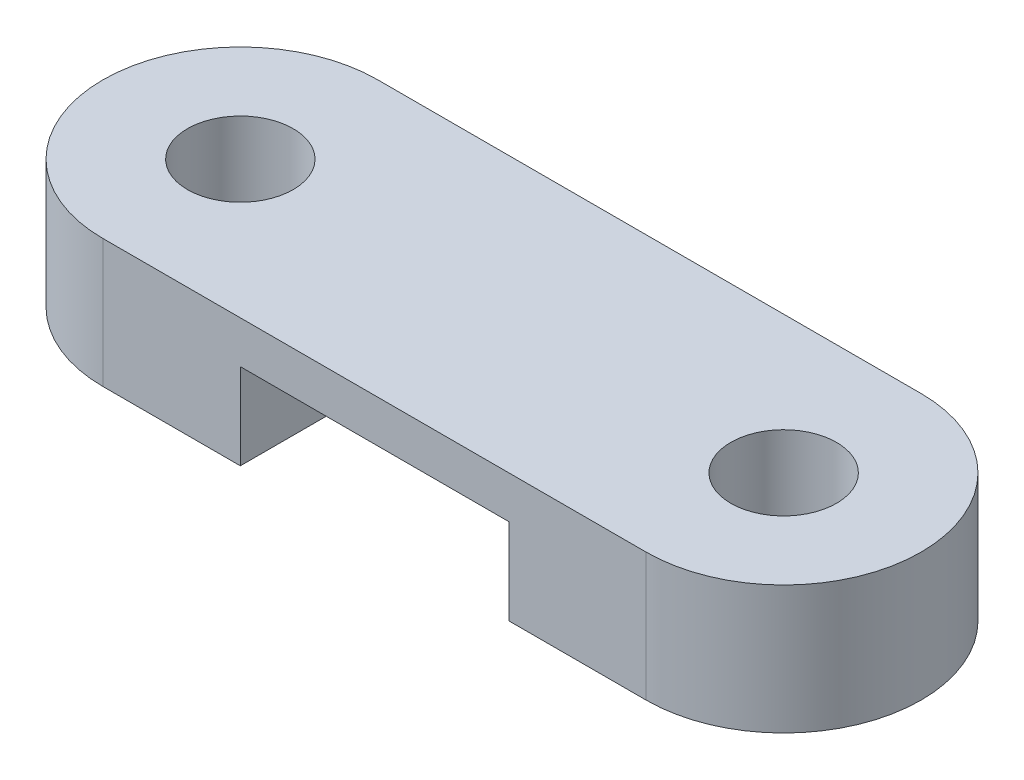
ISO-10303-21;
HEADER;
FILE_DESCRIPTION(('STEP AP214'),'2;1');
FILE_NAME('part.step','',(''),(''),'','','');
FILE_SCHEMA(('AUTOMOTIVE_DESIGN { 1 0 10303 214 1 1 1 1 }'));
ENDSEC;
DATA;
#1=APPLICATION_CONTEXT('core data for automotive mechanical design processes');
#2=APPLICATION_PROTOCOL_DEFINITION('international standard','automotive_design',2000,#1);
#3=PRODUCT_CONTEXT('',#1,'mechanical');
#4=PRODUCT('Part','Part','',(#3));
#5=PRODUCT_RELATED_PRODUCT_CATEGORY('part','',(#4));
#6=PRODUCT_DEFINITION_FORMATION('','',#4);
#7=PRODUCT_DEFINITION_CONTEXT('part definition',#1,'design');
#8=PRODUCT_DEFINITION('design','',#6,#7);
#9=PRODUCT_DEFINITION_SHAPE('','',#8);
#10=(LENGTH_UNIT() NAMED_UNIT(*) SI_UNIT(.MILLI.,.METRE.));
#11=(NAMED_UNIT(*) PLANE_ANGLE_UNIT() SI_UNIT($,.RADIAN.));
#12=(NAMED_UNIT(*) SI_UNIT($,.STERADIAN.) SOLID_ANGLE_UNIT());
#13=UNCERTAINTY_MEASURE_WITH_UNIT(LENGTH_MEASURE(1.E-05),#10,'distance_accuracy_value','');
#14=(GEOMETRIC_REPRESENTATION_CONTEXT(3) GLOBAL_UNCERTAINTY_ASSIGNED_CONTEXT((#13)) GLOBAL_UNIT_ASSIGNED_CONTEXT((#10,
#11,#12)) REPRESENTATION_CONTEXT('',''));
#15=CARTESIAN_POINT('',(0.,0.,0.));
#16=DIRECTION('',(0.,0.,1.));
#17=DIRECTION('',(1.,0.,0.));
#18=AXIS2_PLACEMENT_3D('',#15,#16,#17);
#19=CARTESIAN_POINT('',(0.,0.,0.));
#20=DIRECTION('',(0.,1.,0.));
#21=DIRECTION('',(0.,0.,1.));
#22=AXIS2_PLACEMENT_3D('',#19,#20,#21);
#23=PLANE('',#22);
#24=DIRECTION('',(0.,0.,-1.));
#25=VECTOR('',#24,1.);
#26=CARTESIAN_POINT('',(3.175,0.,0.));
#27=LINE('',#26,#25);
#28=CARTESIAN_POINT('',(3.175,0.,3.25));
#29=VERTEX_POINT('',#28);
#30=CARTESIAN_POINT('',(3.175,0.,-3.25));
#31=VERTEX_POINT('',#30);
#32=EDGE_CURVE('E136',#29,#31,#27,.T.);
#33=ORIENTED_EDGE('',*,*,#32,.F.);
#34=DIRECTION('',(1.,0.,0.));
#35=VECTOR('',#34,1.);
#36=CARTESIAN_POINT('',(0.,0.,3.25));
#37=LINE('',#36,#35);
#38=CARTESIAN_POINT('',(-3.175,0.,3.25));
#39=VERTEX_POINT('',#38);
#40=EDGE_CURVE('E184',#39,#29,#37,.T.);
#41=ORIENTED_EDGE('',*,*,#40,.F.);
#42=DIRECTION('',(0.,0.,-1.));
#43=VECTOR('',#42,1.);
#44=CARTESIAN_POINT('',(-3.175,0.,0.));
#45=LINE('',#44,#43);
#46=CARTESIAN_POINT('',(-3.175,0.,-3.25));
#47=VERTEX_POINT('',#46);
#48=EDGE_CURVE('E150',#39,#47,#45,.T.);
#49=ORIENTED_EDGE('',*,*,#48,.T.);
#50=DIRECTION('',(1.,0.,0.));
#51=VECTOR('',#50,1.);
#52=CARTESIAN_POINT('',(0.,0.,-3.25));
#53=LINE('',#52,#51);
#54=EDGE_CURVE('E176',#47,#31,#53,.T.);
#55=ORIENTED_EDGE('',*,*,#54,.T.);
#56=EDGE_LOOP('',(#33,#41,#49,#55));
#57=FACE_BOUND('',#56,.T.);
#58=ADVANCED_FACE('F41',(#57),#23,.F.);
#59=CARTESIAN_POINT('',(0.,1.,-3.25));
#60=DIRECTION('',(0.,0.,-1.));
#61=DIRECTION('',(-1.,0.,0.));
#62=AXIS2_PLACEMENT_3D('',#59,#60,#61);
#63=PLANE('',#62);
#64=ORIENTED_EDGE('',*,*,#54,.F.);
#65=DIRECTION('',(0.,1.,0.));
#66=VECTOR('',#65,1.);
#67=CARTESIAN_POINT('',(-3.175,-2.032,-3.25));
#68=LINE('',#67,#66);
#69=CARTESIAN_POINT('',(-3.175,-2.032,-3.25));
#70=VERTEX_POINT('',#69);
#71=EDGE_CURVE('E57',#70,#47,#68,.T.);
#72=ORIENTED_EDGE('',*,*,#71,.F.);
#73=DIRECTION('',(1.,0.,0.));
#74=VECTOR('',#73,1.);
#75=CARTESIAN_POINT('',(0.,-2.032,-3.25));
#76=LINE('',#75,#74);
#77=CARTESIAN_POINT('',(-6.425,-2.032,-3.25));
#78=VERTEX_POINT('',#77);
#79=EDGE_CURVE('E157',#78,#70,#76,.T.);
#80=ORIENTED_EDGE('',*,*,#79,.F.);
#81=DIRECTION('',(0.,-1.,0.));
#82=VECTOR('',#81,1.);
#83=CARTESIAN_POINT('',(-6.425,1.,-3.25));
#84=LINE('',#83,#82);
#85=CARTESIAN_POINT('',(-6.425,1.,-3.25));
#86=VERTEX_POINT('',#85);
#87=EDGE_CURVE('E11',#86,#78,#84,.T.);
#88=ORIENTED_EDGE('',*,*,#87,.F.);
#89=DIRECTION('',(1.,0.,0.));
#90=VECTOR('',#89,1.);
#91=CARTESIAN_POINT('',(0.,1.,-3.25));
#92=LINE('',#91,#90);
#93=CARTESIAN_POINT('',(6.425,1.,-3.25));
#94=VERTEX_POINT('',#93);
#95=EDGE_CURVE('E183',#86,#94,#92,.T.);
#96=ORIENTED_EDGE('',*,*,#95,.T.);
#97=DIRECTION('',(0.,-1.,0.));
#98=VECTOR('',#97,1.);
#99=CARTESIAN_POINT('',(6.425,1.,-3.25));
#100=LINE('',#99,#98);
#101=CARTESIAN_POINT('',(6.425,-2.032,-3.25));
#102=VERTEX_POINT('',#101);
#103=EDGE_CURVE('E116',#94,#102,#100,.T.);
#104=ORIENTED_EDGE('',*,*,#103,.T.);
#105=DIRECTION('',(1.,0.,0.));
#106=VECTOR('',#105,1.);
#107=CARTESIAN_POINT('',(0.,-2.032,-3.25));
#108=LINE('',#107,#106);
#109=CARTESIAN_POINT('',(3.175,-2.032,-3.25));
#110=VERTEX_POINT('',#109);
#111=EDGE_CURVE('E124',#110,#102,#108,.T.);
#112=ORIENTED_EDGE('',*,*,#111,.F.);
#113=DIRECTION('',(0.,1.,0.));
#114=VECTOR('',#113,1.);
#115=CARTESIAN_POINT('',(3.175,-2.032,-3.25));
#116=LINE('',#115,#114);
#117=EDGE_CURVE('E144',#110,#31,#116,.T.);
#118=ORIENTED_EDGE('',*,*,#117,.T.);
#119=EDGE_LOOP('',(#64,#72,#80,#88,#96,#104,#112,#118));
#120=FACE_BOUND('',#119,.T.);
#121=ADVANCED_FACE('F220',(#120),#63,.T.);
#122=CARTESIAN_POINT('',(-6.425,1.,0.));
#123=DIRECTION('',(0.,-1.,0.));
#124=DIRECTION('',(0.,0.,-1.));
#125=AXIS2_PLACEMENT_3D('',#122,#123,#124);
#126=CYLINDRICAL_SURFACE('',#125,3.25);
#127=ORIENTED_EDGE('',*,*,#87,.T.);
#128=CARTESIAN_POINT('',(-6.425,-2.032,0.));
#129=DIRECTION('',(0.,1.,0.));
#130=DIRECTION('',(0.,0.,1.));
#131=AXIS2_PLACEMENT_3D('',#128,#129,#130);
#132=CIRCLE('',#131,3.25);
#133=CARTESIAN_POINT('',(-6.425,-2.032,3.25));
#134=VERTEX_POINT('',#133);
#135=EDGE_CURVE('E160',#78,#134,#132,.T.);
#136=ORIENTED_EDGE('',*,*,#135,.T.);
#137=DIRECTION('',(0.,-1.,0.));
#138=VECTOR('',#137,1.);
#139=CARTESIAN_POINT('',(-6.425,1.,3.25));
#140=LINE('',#139,#138);
#141=CARTESIAN_POINT('',(-6.425,1.,3.25));
#142=VERTEX_POINT('',#141);
#143=EDGE_CURVE('E50',#142,#134,#140,.T.);
#144=ORIENTED_EDGE('',*,*,#143,.F.);
#145=CARTESIAN_POINT('',(-6.425,1.,0.));
#146=DIRECTION('',(0.,1.,0.));
#147=DIRECTION('',(0.,0.,1.));
#148=AXIS2_PLACEMENT_3D('',#145,#146,#147);
#149=CIRCLE('',#148,3.25);
#150=EDGE_CURVE('E188',#86,#142,#149,.T.);
#151=ORIENTED_EDGE('',*,*,#150,.F.);
#152=EDGE_LOOP('',(#127,#136,#144,#151));
#153=FACE_BOUND('',#152,.T.);
#154=ADVANCED_FACE('F216',(#153),#126,.T.);
#155=CARTESIAN_POINT('',(0.,1.,3.25));
#156=DIRECTION('',(0.,0.,-1.));
#157=DIRECTION('',(-1.,0.,0.));
#158=AXIS2_PLACEMENT_3D('',#155,#156,#157);
#159=PLANE('',#158);
#160=ORIENTED_EDGE('',*,*,#143,.T.);
#161=DIRECTION('',(1.,0.,0.));
#162=VECTOR('',#161,1.);
#163=CARTESIAN_POINT('',(0.,-2.032,3.25));
#164=LINE('',#163,#162);
#165=CARTESIAN_POINT('',(-3.175,-2.032,3.25));
#166=VERTEX_POINT('',#165);
#167=EDGE_CURVE('E164',#134,#166,#164,.T.);
#168=ORIENTED_EDGE('',*,*,#167,.T.);
#169=DIRECTION('',(0.,1.,0.));
#170=VECTOR('',#169,1.);
#171=CARTESIAN_POINT('',(-3.175,-2.032,3.25));
#172=LINE('',#171,#170);
#173=EDGE_CURVE('E171',#166,#39,#172,.T.);
#174=ORIENTED_EDGE('',*,*,#173,.T.);
#175=ORIENTED_EDGE('',*,*,#40,.T.);
#176=DIRECTION('',(0.,1.,0.));
#177=VECTOR('',#176,1.);
#178=CARTESIAN_POINT('',(3.175,-2.032,3.25));
#179=LINE('',#178,#177);
#180=CARTESIAN_POINT('',(3.175,-2.032,3.25));
#181=VERTEX_POINT('',#180);
#182=EDGE_CURVE('E129',#181,#29,#179,.T.);
#183=ORIENTED_EDGE('',*,*,#182,.F.);
#184=DIRECTION('',(1.,0.,0.));
#185=VECTOR('',#184,1.);
#186=CARTESIAN_POINT('',(0.,-2.032,3.25));
#187=LINE('',#186,#185);
#188=CARTESIAN_POINT('',(6.425,-2.032,3.25));
#189=VERTEX_POINT('',#188);
#190=EDGE_CURVE('E123',#181,#189,#187,.T.);
#191=ORIENTED_EDGE('',*,*,#190,.T.);
#192=DIRECTION('',(0.,-1.,0.));
#193=VECTOR('',#192,1.);
#194=CARTESIAN_POINT('',(6.425,1.,3.25));
#195=LINE('',#194,#193);
#196=CARTESIAN_POINT('',(6.425,1.,3.25));
#197=VERTEX_POINT('',#196);
#198=EDGE_CURVE('E109',#197,#189,#195,.T.);
#199=ORIENTED_EDGE('',*,*,#198,.F.);
#200=DIRECTION('',(1.,0.,0.));
#201=VECTOR('',#200,1.);
#202=CARTESIAN_POINT('',(0.,1.,3.25));
#203=LINE('',#202,#201);
#204=EDGE_CURVE('E192',#142,#197,#203,.T.);
#205=ORIENTED_EDGE('',*,*,#204,.F.);
#206=EDGE_LOOP('',(#160,#168,#174,#175,#183,#191,#199,#205));
#207=FACE_BOUND('',#206,.T.);
#208=ADVANCED_FACE('F127',(#207),#159,.F.);
#209=CARTESIAN_POINT('',(6.425,1.,0.));
#210=DIRECTION('',(0.,-1.,0.));
#211=DIRECTION('',(0.,0.,-1.));
#212=AXIS2_PLACEMENT_3D('',#209,#210,#211);
#213=CYLINDRICAL_SURFACE('',#212,3.25);
#214=ORIENTED_EDGE('',*,*,#198,.T.);
#215=CARTESIAN_POINT('',(6.425,-2.032,0.));
#216=DIRECTION('',(0.,1.,0.));
#217=DIRECTION('',(0.,0.,1.));
#218=AXIS2_PLACEMENT_3D('',#215,#216,#217);
#219=CIRCLE('',#218,3.25);
#220=EDGE_CURVE('E112',#189,#102,#219,.T.);
#221=ORIENTED_EDGE('',*,*,#220,.T.);
#222=ORIENTED_EDGE('',*,*,#103,.F.);
#223=CARTESIAN_POINT('',(6.425,1.,0.));
#224=DIRECTION('',(0.,1.,0.));
#225=DIRECTION('',(0.,0.,1.));
#226=AXIS2_PLACEMENT_3D('',#223,#224,#225);
#227=CIRCLE('',#226,3.25);
#228=EDGE_CURVE('E65',#197,#94,#227,.T.);
#229=ORIENTED_EDGE('',*,*,#228,.F.);
#230=EDGE_LOOP('',(#214,#221,#222,#229));
#231=FACE_BOUND('',#230,.T.);
#232=ADVANCED_FACE('F111',(#231),#213,.T.);
#233=CARTESIAN_POINT('',(-6.425,1.,0.));
#234=DIRECTION('',(0.,-1.,0.));
#235=DIRECTION('',(0.,0.,-1.));
#236=AXIS2_PLACEMENT_3D('',#233,#234,#235);
#237=CYLINDRICAL_SURFACE('',#236,1.25);
#238=CARTESIAN_POINT('',(-6.425,1.,0.));
#239=DIRECTION('',(0.,1.,0.));
#240=DIRECTION('',(0.,0.,1.));
#241=AXIS2_PLACEMENT_3D('',#238,#239,#240);
#242=CIRCLE('',#241,1.25);
#243=CARTESIAN_POINT('',(-6.425,1.,1.25));
#244=VERTEX_POINT('',#243);
#245=EDGE_CURVE('E179',#244,#244,#242,.T.);
#246=ORIENTED_EDGE('',*,*,#245,.T.);
#247=EDGE_LOOP('',(#246));
#248=FACE_BOUND('',#247,.T.);
#249=CARTESIAN_POINT('',(-6.425,-2.032,0.));
#250=DIRECTION('',(0.,1.,0.));
#251=DIRECTION('',(0.,0.,1.));
#252=AXIS2_PLACEMENT_3D('',#249,#250,#251);
#253=CIRCLE('',#252,1.25);
#254=CARTESIAN_POINT('',(-6.425,-2.032,1.25));
#255=VERTEX_POINT('',#254);
#256=EDGE_CURVE('E153',#255,#255,#253,.T.);
#257=ORIENTED_EDGE('',*,*,#256,.F.);
#258=EDGE_LOOP('',(#257));
#259=FACE_BOUND('',#258,.T.);
#260=ADVANCED_FACE('F43',(#248,#259),#237,.F.);
#261=CARTESIAN_POINT('',(6.425,1.,0.));
#262=DIRECTION('',(0.,-1.,0.));
#263=DIRECTION('',(0.,0.,-1.));
#264=AXIS2_PLACEMENT_3D('',#261,#262,#263);
#265=CYLINDRICAL_SURFACE('',#264,1.25);
#266=CARTESIAN_POINT('',(6.425,1.,0.));
#267=DIRECTION('',(0.,1.,0.));
#268=DIRECTION('',(0.,0.,1.));
#269=AXIS2_PLACEMENT_3D('',#266,#267,#268);
#270=CIRCLE('',#269,1.25);
#271=CARTESIAN_POINT('',(6.425,1.,1.25));
#272=VERTEX_POINT('',#271);
#273=EDGE_CURVE('E197',#272,#272,#270,.T.);
#274=ORIENTED_EDGE('',*,*,#273,.T.);
#275=EDGE_LOOP('',(#274));
#276=FACE_BOUND('',#275,.T.);
#277=CARTESIAN_POINT('',(6.425,-2.032,0.));
#278=DIRECTION('',(0.,1.,0.));
#279=DIRECTION('',(0.,0.,1.));
#280=AXIS2_PLACEMENT_3D('',#277,#278,#279);
#281=CIRCLE('',#280,1.25);
#282=CARTESIAN_POINT('',(6.425,-2.032,1.25));
#283=VERTEX_POINT('',#282);
#284=EDGE_CURVE('E132',#283,#283,#281,.T.);
#285=ORIENTED_EDGE('',*,*,#284,.F.);
#286=EDGE_LOOP('',(#285));
#287=FACE_BOUND('',#286,.T.);
#288=ADVANCED_FACE('F231',(#276,#287),#265,.F.);
#289=CARTESIAN_POINT('',(0.,1.,0.));
#290=DIRECTION('',(0.,1.,0.));
#291=DIRECTION('',(0.,0.,1.));
#292=AXIS2_PLACEMENT_3D('',#289,#290,#291);
#293=PLANE('',#292);
#294=ORIENTED_EDGE('',*,*,#245,.F.);
#295=EDGE_LOOP('',(#294));
#296=FACE_BOUND('',#295,.T.);
#297=ORIENTED_EDGE('',*,*,#95,.F.);
#298=ORIENTED_EDGE('',*,*,#150,.T.);
#299=ORIENTED_EDGE('',*,*,#204,.T.);
#300=ORIENTED_EDGE('',*,*,#228,.T.);
#301=EDGE_LOOP('',(#297,#298,#299,#300));
#302=FACE_BOUND('',#301,.T.);
#303=ORIENTED_EDGE('',*,*,#273,.F.);
#304=EDGE_LOOP('',(#303));
#305=FACE_BOUND('',#304,.T.);
#306=ADVANCED_FACE('F228',(#296,#302,#305),#293,.T.);
#307=CARTESIAN_POINT('',(-3.175,-2.032,0.));
#308=DIRECTION('',(1.,0.,0.));
#309=DIRECTION('',(0.,0.,-1.));
#310=AXIS2_PLACEMENT_3D('',#307,#308,#309);
#311=PLANE('',#310);
#312=ORIENTED_EDGE('',*,*,#48,.F.);
#313=ORIENTED_EDGE('',*,*,#173,.F.);
#314=DIRECTION('',(0.,0.,-1.));
#315=VECTOR('',#314,1.);
#316=CARTESIAN_POINT('',(-3.175,-2.032,0.));
#317=LINE('',#316,#315);
#318=EDGE_CURVE('E168',#166,#70,#317,.T.);
#319=ORIENTED_EDGE('',*,*,#318,.T.);
#320=ORIENTED_EDGE('',*,*,#71,.T.);
#321=EDGE_LOOP('',(#312,#313,#319,#320));
#322=FACE_BOUND('',#321,.T.);
#323=ADVANCED_FACE('F221',(#322),#311,.T.);
#324=CARTESIAN_POINT('',(0.,-2.032,0.));
#325=DIRECTION('',(0.,1.,0.));
#326=DIRECTION('',(0.,0.,1.));
#327=AXIS2_PLACEMENT_3D('',#324,#325,#326);
#328=PLANE('',#327);
#329=ORIENTED_EDGE('',*,*,#256,.T.);
#330=EDGE_LOOP('',(#329));
#331=FACE_BOUND('',#330,.T.);
#332=ORIENTED_EDGE('',*,*,#79,.T.);
#333=ORIENTED_EDGE('',*,*,#318,.F.);
#334=ORIENTED_EDGE('',*,*,#167,.F.);
#335=ORIENTED_EDGE('',*,*,#135,.F.);
#336=EDGE_LOOP('',(#332,#333,#334,#335));
#337=FACE_BOUND('',#336,.T.);
#338=ADVANCED_FACE('F215',(#331,#337),#328,.F.);
#339=CARTESIAN_POINT('',(3.175,-2.032,0.));
#340=DIRECTION('',(1.,0.,0.));
#341=DIRECTION('',(0.,0.,-1.));
#342=AXIS2_PLACEMENT_3D('',#339,#340,#341);
#343=PLANE('',#342);
#344=ORIENTED_EDGE('',*,*,#32,.T.);
#345=ORIENTED_EDGE('',*,*,#117,.F.);
#346=DIRECTION('',(0.,0.,-1.));
#347=VECTOR('',#346,1.);
#348=CARTESIAN_POINT('',(3.175,-2.032,0.));
#349=LINE('',#348,#347);
#350=EDGE_CURVE('E141',#181,#110,#349,.T.);
#351=ORIENTED_EDGE('',*,*,#350,.F.);
#352=ORIENTED_EDGE('',*,*,#182,.T.);
#353=EDGE_LOOP('',(#344,#345,#351,#352));
#354=FACE_BOUND('',#353,.T.);
#355=ADVANCED_FACE('F227',(#354),#343,.F.);
#356=CARTESIAN_POINT('',(0.,-2.032,0.));
#357=DIRECTION('',(0.,1.,0.));
#358=DIRECTION('',(0.,0.,1.));
#359=AXIS2_PLACEMENT_3D('',#356,#357,#358);
#360=PLANE('',#359);
#361=ORIENTED_EDGE('',*,*,#284,.T.);
#362=EDGE_LOOP('',(#361));
#363=FACE_BOUND('',#362,.T.);
#364=ORIENTED_EDGE('',*,*,#190,.F.);
#365=ORIENTED_EDGE('',*,*,#350,.T.);
#366=ORIENTED_EDGE('',*,*,#111,.T.);
#367=ORIENTED_EDGE('',*,*,#220,.F.);
#368=EDGE_LOOP('',(#364,#365,#366,#367));
#369=FACE_BOUND('',#368,.T.);
#370=ADVANCED_FACE('F121',(#363,#369),#360,.F.);
#371=CLOSED_SHELL('',(#58,#121,#154,#208,#232,#260,#288,#306,#323,#338,#355,#370));
#372=MANIFOLD_SOLID_BREP('B2',#371);
#373=ADVANCED_BREP_SHAPE_REPRESENTATION('',(#18,#372),#14);
#374=SHAPE_DEFINITION_REPRESENTATION(#9,#373);
ENDSEC;
END-ISO-10303-21;
